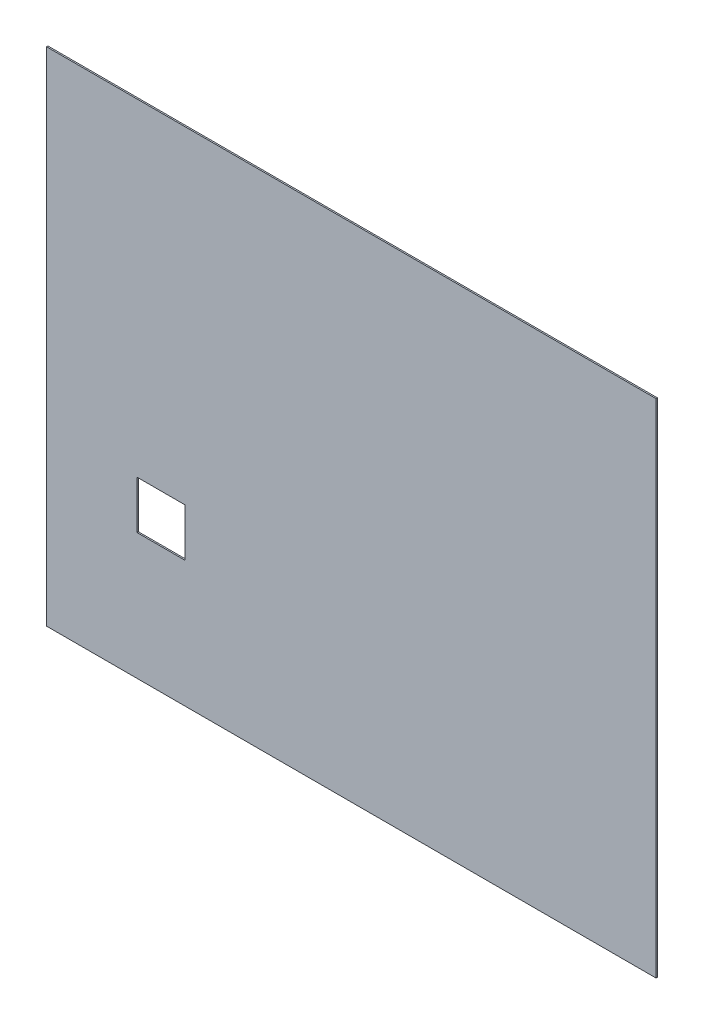
ISO-10303-21;
HEADER;
FILE_DESCRIPTION(('STEP AP214'),'2;1');
FILE_NAME('part.step','',(''),(''),'','','');
FILE_SCHEMA(('AUTOMOTIVE_DESIGN { 1 0 10303 214 1 1 1 1 }'));
ENDSEC;
DATA;
#1=APPLICATION_CONTEXT('core data for automotive mechanical design processes');
#2=APPLICATION_PROTOCOL_DEFINITION('international standard','automotive_design',2000,#1);
#3=PRODUCT_CONTEXT('',#1,'mechanical');
#4=PRODUCT('Part','Part','',(#3));
#5=PRODUCT_RELATED_PRODUCT_CATEGORY('part','',(#4));
#6=PRODUCT_DEFINITION_FORMATION('','',#4);
#7=PRODUCT_DEFINITION_CONTEXT('part definition',#1,'design');
#8=PRODUCT_DEFINITION('design','',#6,#7);
#9=PRODUCT_DEFINITION_SHAPE('','',#8);
#10=(LENGTH_UNIT() NAMED_UNIT(*) SI_UNIT(.MILLI.,.METRE.));
#11=(NAMED_UNIT(*) PLANE_ANGLE_UNIT() SI_UNIT($,.RADIAN.));
#12=(NAMED_UNIT(*) SI_UNIT($,.STERADIAN.) SOLID_ANGLE_UNIT());
#13=UNCERTAINTY_MEASURE_WITH_UNIT(LENGTH_MEASURE(1.E-05),#10,'distance_accuracy_value','');
#14=(GEOMETRIC_REPRESENTATION_CONTEXT(3) GLOBAL_UNCERTAINTY_ASSIGNED_CONTEXT((#13)) GLOBAL_UNIT_ASSIGNED_CONTEXT((#10,
#11,#12)) REPRESENTATION_CONTEXT('',''));
#15=CARTESIAN_POINT('',(0.,0.,0.));
#16=DIRECTION('',(0.,0.,1.));
#17=DIRECTION('',(1.,0.,0.));
#18=AXIS2_PLACEMENT_3D('',#15,#16,#17);
#19=CARTESIAN_POINT('',(215.9,-177.8,0.9906));
#20=DIRECTION('',(-1.,0.,0.));
#21=DIRECTION('',(0.,0.,1.));
#22=AXIS2_PLACEMENT_3D('',#19,#20,#21);
#23=PLANE('',#22);
#24=DIRECTION('',(0.,1.,0.));
#25=VECTOR('',#24,1.);
#26=CARTESIAN_POINT('',(215.9,-177.8,0.));
#27=LINE('',#26,#25);
#28=CARTESIAN_POINT('',(215.9,-177.8,0.));
#29=VERTEX_POINT('',#28);
#30=CARTESIAN_POINT('',(215.9,177.8,0.));
#31=VERTEX_POINT('',#30);
#32=EDGE_CURVE('E151',#29,#31,#27,.T.);
#33=ORIENTED_EDGE('',*,*,#32,.T.);
#34=DIRECTION('',(0.,0.,-1.));
#35=VECTOR('',#34,1.);
#36=CARTESIAN_POINT('',(215.9,177.8,0.9906));
#37=LINE('',#36,#35);
#38=CARTESIAN_POINT('',(215.9,177.8,0.9906));
#39=VERTEX_POINT('',#38);
#40=EDGE_CURVE('E11',#39,#31,#37,.T.);
#41=ORIENTED_EDGE('',*,*,#40,.F.);
#42=DIRECTION('',(0.,1.,0.));
#43=VECTOR('',#42,1.);
#44=CARTESIAN_POINT('',(215.9,-177.8,0.9906));
#45=LINE('',#44,#43);
#46=CARTESIAN_POINT('',(215.9,-177.8,0.9906));
#47=VERTEX_POINT('',#46);
#48=EDGE_CURVE('E157',#47,#39,#45,.T.);
#49=ORIENTED_EDGE('',*,*,#48,.F.);
#50=DIRECTION('',(0.,0.,-1.));
#51=VECTOR('',#50,1.);
#52=CARTESIAN_POINT('',(215.9,-177.8,0.9906));
#53=LINE('',#52,#51);
#54=EDGE_CURVE('E171',#47,#29,#53,.T.);
#55=ORIENTED_EDGE('',*,*,#54,.T.);
#56=EDGE_LOOP('',(#33,#41,#49,#55));
#57=FACE_BOUND('',#56,.T.);
#58=ADVANCED_FACE('F39',(#57),#23,.F.);
#59=CARTESIAN_POINT('',(-215.9,177.8,0.9906));
#60=DIRECTION('',(0.,-1.,0.));
#61=DIRECTION('',(0.,0.,-1.));
#62=AXIS2_PLACEMENT_3D('',#59,#60,#61);
#63=PLANE('',#62);
#64=DIRECTION('',(-1.,0.,0.));
#65=VECTOR('',#64,1.);
#66=CARTESIAN_POINT('',(-215.9,177.8,0.));
#67=LINE('',#66,#65);
#68=CARTESIAN_POINT('',(-215.9,177.8,0.));
#69=VERTEX_POINT('',#68);
#70=EDGE_CURVE('E175',#31,#69,#67,.T.);
#71=ORIENTED_EDGE('',*,*,#70,.T.);
#72=DIRECTION('',(0.,0.,-1.));
#73=VECTOR('',#72,1.);
#74=CARTESIAN_POINT('',(-215.9,177.8,0.9906));
#75=LINE('',#74,#73);
#76=CARTESIAN_POINT('',(-215.9,177.8,0.9906));
#77=VERTEX_POINT('',#76);
#78=EDGE_CURVE('E47',#77,#69,#75,.T.);
#79=ORIENTED_EDGE('',*,*,#78,.F.);
#80=DIRECTION('',(-1.,0.,0.));
#81=VECTOR('',#80,1.);
#82=CARTESIAN_POINT('',(-215.9,177.8,0.9906));
#83=LINE('',#82,#81);
#84=EDGE_CURVE('E161',#39,#77,#83,.T.);
#85=ORIENTED_EDGE('',*,*,#84,.F.);
#86=ORIENTED_EDGE('',*,*,#40,.T.);
#87=EDGE_LOOP('',(#71,#79,#85,#86));
#88=FACE_BOUND('',#87,.T.);
#89=ADVANCED_FACE('F209',(#88),#63,.F.);
#90=CARTESIAN_POINT('',(-215.9,-177.8,0.9906));
#91=DIRECTION('',(1.,0.,0.));
#92=DIRECTION('',(0.,0.,-1.));
#93=AXIS2_PLACEMENT_3D('',#90,#91,#92);
#94=PLANE('',#93);
#95=DIRECTION('',(0.,-1.,0.));
#96=VECTOR('',#95,1.);
#97=CARTESIAN_POINT('',(-215.9,-177.8,0.));
#98=LINE('',#97,#96);
#99=CARTESIAN_POINT('',(-215.9,-177.8,0.));
#100=VERTEX_POINT('',#99);
#101=EDGE_CURVE('E178',#69,#100,#98,.T.);
#102=ORIENTED_EDGE('',*,*,#101,.T.);
#103=DIRECTION('',(0.,0.,-1.));
#104=VECTOR('',#103,1.);
#105=CARTESIAN_POINT('',(-215.9,-177.8,0.9906));
#106=LINE('',#105,#104);
#107=CARTESIAN_POINT('',(-215.9,-177.8,0.9906));
#108=VERTEX_POINT('',#107);
#109=EDGE_CURVE('E186',#108,#100,#106,.T.);
#110=ORIENTED_EDGE('',*,*,#109,.F.);
#111=DIRECTION('',(0.,-1.,0.));
#112=VECTOR('',#111,1.);
#113=CARTESIAN_POINT('',(-215.9,-177.8,0.9906));
#114=LINE('',#113,#112);
#115=EDGE_CURVE('E165',#77,#108,#114,.T.);
#116=ORIENTED_EDGE('',*,*,#115,.F.);
#117=ORIENTED_EDGE('',*,*,#78,.T.);
#118=EDGE_LOOP('',(#102,#110,#116,#117));
#119=FACE_BOUND('',#118,.T.);
#120=ADVANCED_FACE('F195',(#119),#94,.F.);
#121=CARTESIAN_POINT('',(-215.9,-177.8,0.9906));
#122=DIRECTION('',(0.,1.,0.));
#123=DIRECTION('',(0.,0.,1.));
#124=AXIS2_PLACEMENT_3D('',#121,#122,#123);
#125=PLANE('',#124);
#126=DIRECTION('',(1.,0.,0.));
#127=VECTOR('',#126,1.);
#128=CARTESIAN_POINT('',(-215.9,-177.8,0.));
#129=LINE('',#128,#127);
#130=EDGE_CURVE('E162',#100,#29,#129,.T.);
#131=ORIENTED_EDGE('',*,*,#130,.T.);
#132=ORIENTED_EDGE('',*,*,#54,.F.);
#133=DIRECTION('',(1.,0.,0.));
#134=VECTOR('',#133,1.);
#135=CARTESIAN_POINT('',(-215.9,-177.8,0.9906));
#136=LINE('',#135,#134);
#137=EDGE_CURVE('E168',#108,#47,#136,.T.);
#138=ORIENTED_EDGE('',*,*,#137,.F.);
#139=ORIENTED_EDGE('',*,*,#109,.T.);
#140=EDGE_LOOP('',(#131,#132,#138,#139));
#141=FACE_BOUND('',#140,.T.);
#142=ADVANCED_FACE('F202',(#141),#125,.F.);
#143=CARTESIAN_POINT('',(0.,0.,0.9906));
#144=DIRECTION('',(0.,0.,-1.));
#145=DIRECTION('',(-1.,0.,0.));
#146=AXIS2_PLACEMENT_3D('',#143,#144,#145);
#147=PLANE('',#146);
#148=DIRECTION('',(-1.,0.,0.));
#149=VECTOR('',#148,1.);
#150=CARTESIAN_POINT('',(-151.9,-54.3,0.9906));
#151=LINE('',#150,#149);
#152=CARTESIAN_POINT('',(-117.9,-54.3,0.9906));
#153=VERTEX_POINT('',#152);
#154=CARTESIAN_POINT('',(-151.9,-54.3,0.9906));
#155=VERTEX_POINT('',#154);
#156=EDGE_CURVE('E141',#153,#155,#151,.T.);
#157=ORIENTED_EDGE('',*,*,#156,.F.);
#158=DIRECTION('',(0.,1.,0.));
#159=VECTOR('',#158,1.);
#160=CARTESIAN_POINT('',(-117.9,-88.3,0.9906));
#161=LINE('',#160,#159);
#162=CARTESIAN_POINT('',(-117.9,-88.3,0.9906));
#163=VERTEX_POINT('',#162);
#164=EDGE_CURVE('E54',#163,#153,#161,.T.);
#165=ORIENTED_EDGE('',*,*,#164,.F.);
#166=DIRECTION('',(1.,0.,0.));
#167=VECTOR('',#166,1.);
#168=CARTESIAN_POINT('',(-151.9,-88.3,0.9906));
#169=LINE('',#168,#167);
#170=CARTESIAN_POINT('',(-151.9,-88.3,0.9906));
#171=VERTEX_POINT('',#170);
#172=EDGE_CURVE('E125',#171,#163,#169,.T.);
#173=ORIENTED_EDGE('',*,*,#172,.F.);
#174=DIRECTION('',(0.,-1.,0.));
#175=VECTOR('',#174,1.);
#176=CARTESIAN_POINT('',(-151.9,-88.3,0.9906));
#177=LINE('',#176,#175);
#178=EDGE_CURVE('E129',#155,#171,#177,.T.);
#179=ORIENTED_EDGE('',*,*,#178,.F.);
#180=EDGE_LOOP('',(#157,#165,#173,#179));
#181=FACE_BOUND('',#180,.T.);
#182=ORIENTED_EDGE('',*,*,#48,.T.);
#183=ORIENTED_EDGE('',*,*,#84,.T.);
#184=ORIENTED_EDGE('',*,*,#115,.T.);
#185=ORIENTED_EDGE('',*,*,#137,.T.);
#186=EDGE_LOOP('',(#182,#183,#184,#185));
#187=FACE_BOUND('',#186,.T.);
#188=ADVANCED_FACE('F208',(#181,#187),#147,.F.);
#189=CARTESIAN_POINT('',(0.,0.,0.));
#190=DIRECTION('',(0.,0.,-1.));
#191=DIRECTION('',(-1.,0.,0.));
#192=AXIS2_PLACEMENT_3D('',#189,#190,#191);
#193=PLANE('',#192);
#194=CARTESIAN_POINT('',(-178.932328771552,-142.488335238859,0.));
#195=DIRECTION('',(0.,0.,-1.));
#196=DIRECTION('',(-1.,0.,0.));
#197=AXIS2_PLACEMENT_3D('',#194,#195,#196);
#198=CIRCLE('',#197,15.9184710640516);
#199=CARTESIAN_POINT('',(-163.013857707501,-142.488335238859,0.));
#200=VERTEX_POINT('',#199);
#201=EDGE_CURVE('E274',#200,#200,#198,.T.);
#202=ORIENTED_EDGE('',*,*,#201,.F.);
#203=EDGE_LOOP('',(#202));
#204=FACE_BOUND('',#203,.T.);
#205=CARTESIAN_POINT('',(176.007004595451,-138.100348974707,0.));
#206=DIRECTION('',(0.,0.,-1.));
#207=DIRECTION('',(-1.,0.,0.));
#208=AXIS2_PLACEMENT_3D('',#205,#206,#207);
#209=CIRCLE('',#208,16.8117791918624);
#210=CARTESIAN_POINT('',(192.818783787313,-138.100348974707,0.));
#211=VERTEX_POINT('',#210);
#212=EDGE_CURVE('E273',#211,#211,#209,.T.);
#213=ORIENTED_EDGE('',*,*,#212,.F.);
#214=EDGE_LOOP('',(#213));
#215=FACE_BOUND('',#214,.T.);
#216=CARTESIAN_POINT('',(-178.932328771552,148.581420283257,0.));
#217=DIRECTION('',(0.,0.,-1.));
#218=DIRECTION('',(-1.,0.,0.));
#219=AXIS2_PLACEMENT_3D('',#216,#217,#218);
#220=CIRCLE('',#219,17.9403983595496);
#221=CARTESIAN_POINT('',(-160.991930412003,148.581420283257,0.));
#222=VERTEX_POINT('',#221);
#223=EDGE_CURVE('E286',#222,#222,#220,.T.);
#224=ORIENTED_EDGE('',*,*,#223,.F.);
#225=EDGE_LOOP('',(#224));
#226=FACE_BOUND('',#225,.T.);
#227=CARTESIAN_POINT('',(152.604411186637,148.581420283257,0.));
#228=DIRECTION('',(0.,0.,-1.));
#229=DIRECTION('',(-1.,0.,0.));
#230=AXIS2_PLACEMENT_3D('',#227,#228,#229);
#231=CIRCLE('',#230,16.8117791918624);
#232=CARTESIAN_POINT('',(169.4161903785,148.581420283257,0.));
#233=VERTEX_POINT('',#232);
#234=EDGE_CURVE('E132',#233,#233,#231,.T.);
#235=ORIENTED_EDGE('',*,*,#234,.F.);
#236=EDGE_LOOP('',(#235));
#237=FACE_BOUND('',#236,.T.);
#238=DIRECTION('',(0.,1.,0.));
#239=VECTOR('',#238,1.);
#240=CARTESIAN_POINT('',(-117.9,-88.3,0.));
#241=LINE('',#240,#239);
#242=CARTESIAN_POINT('',(-117.9,-88.3,0.));
#243=VERTEX_POINT('',#242);
#244=CARTESIAN_POINT('',(-117.9,-54.3,0.));
#245=VERTEX_POINT('',#244);
#246=EDGE_CURVE('E106',#243,#245,#241,.T.);
#247=ORIENTED_EDGE('',*,*,#246,.T.);
#248=DIRECTION('',(-1.,0.,0.));
#249=VECTOR('',#248,1.);
#250=CARTESIAN_POINT('',(-151.9,-54.3,0.));
#251=LINE('',#250,#249);
#252=CARTESIAN_POINT('',(-151.9,-54.3,0.));
#253=VERTEX_POINT('',#252);
#254=EDGE_CURVE('E116',#245,#253,#251,.T.);
#255=ORIENTED_EDGE('',*,*,#254,.T.);
#256=DIRECTION('',(0.,-1.,0.));
#257=VECTOR('',#256,1.);
#258=CARTESIAN_POINT('',(-151.9,-88.3,0.));
#259=LINE('',#258,#257);
#260=CARTESIAN_POINT('',(-151.9,-88.3,0.));
#261=VERTEX_POINT('',#260);
#262=EDGE_CURVE('E62',#253,#261,#259,.T.);
#263=ORIENTED_EDGE('',*,*,#262,.T.);
#264=DIRECTION('',(1.,0.,0.));
#265=VECTOR('',#264,1.);
#266=CARTESIAN_POINT('',(-151.9,-88.3,0.));
#267=LINE('',#266,#265);
#268=EDGE_CURVE('E113',#261,#243,#267,.T.);
#269=ORIENTED_EDGE('',*,*,#268,.T.);
#270=EDGE_LOOP('',(#247,#255,#263,#269));
#271=FACE_BOUND('',#270,.T.);
#272=ORIENTED_EDGE('',*,*,#32,.F.);
#273=ORIENTED_EDGE('',*,*,#130,.F.);
#274=ORIENTED_EDGE('',*,*,#101,.F.);
#275=ORIENTED_EDGE('',*,*,#70,.F.);
#276=EDGE_LOOP('',(#272,#273,#274,#275));
#277=FACE_BOUND('',#276,.T.);
#278=ADVANCED_FACE('F121',(#204,#215,#226,#237,#271,#277),#193,.T.);
#279=CARTESIAN_POINT('',(-117.9,-88.3,0.));
#280=DIRECTION('',(1.,0.,0.));
#281=DIRECTION('',(0.,0.,-1.));
#282=AXIS2_PLACEMENT_3D('',#279,#280,#281);
#283=PLANE('',#282);
#284=ORIENTED_EDGE('',*,*,#164,.T.);
#285=DIRECTION('',(0.,0.,1.));
#286=VECTOR('',#285,1.);
#287=CARTESIAN_POINT('',(-117.9,-54.3,0.));
#288=LINE('',#287,#286);
#289=EDGE_CURVE('E102',#245,#153,#288,.T.);
#290=ORIENTED_EDGE('',*,*,#289,.F.);
#291=ORIENTED_EDGE('',*,*,#246,.F.);
#292=DIRECTION('',(0.,0.,1.));
#293=VECTOR('',#292,1.);
#294=CARTESIAN_POINT('',(-117.9,-88.3,0.));
#295=LINE('',#294,#293);
#296=EDGE_CURVE('E148',#243,#163,#295,.T.);
#297=ORIENTED_EDGE('',*,*,#296,.T.);
#298=EDGE_LOOP('',(#284,#290,#291,#297));
#299=FACE_BOUND('',#298,.T.);
#300=ADVANCED_FACE('F104',(#299),#283,.F.);
#301=CARTESIAN_POINT('',(-151.9,-88.3,0.));
#302=DIRECTION('',(0.,-1.,0.));
#303=DIRECTION('',(0.,0.,-1.));
#304=AXIS2_PLACEMENT_3D('',#301,#302,#303);
#305=PLANE('',#304);
#306=ORIENTED_EDGE('',*,*,#172,.T.);
#307=ORIENTED_EDGE('',*,*,#296,.F.);
#308=ORIENTED_EDGE('',*,*,#268,.F.);
#309=DIRECTION('',(0.,0.,1.));
#310=VECTOR('',#309,1.);
#311=CARTESIAN_POINT('',(-151.9,-88.3,0.));
#312=LINE('',#311,#310);
#313=EDGE_CURVE('E152',#261,#171,#312,.T.);
#314=ORIENTED_EDGE('',*,*,#313,.T.);
#315=EDGE_LOOP('',(#306,#307,#308,#314));
#316=FACE_BOUND('',#315,.T.);
#317=ADVANCED_FACE('F227',(#316),#305,.F.);
#318=CARTESIAN_POINT('',(-151.9,-88.3,0.));
#319=DIRECTION('',(-1.,0.,0.));
#320=DIRECTION('',(0.,0.,1.));
#321=AXIS2_PLACEMENT_3D('',#318,#319,#320);
#322=PLANE('',#321);
#323=ORIENTED_EDGE('',*,*,#178,.T.);
#324=ORIENTED_EDGE('',*,*,#313,.F.);
#325=ORIENTED_EDGE('',*,*,#262,.F.);
#326=DIRECTION('',(0.,0.,1.));
#327=VECTOR('',#326,1.);
#328=CARTESIAN_POINT('',(-151.9,-54.3,0.));
#329=LINE('',#328,#327);
#330=EDGE_CURVE('E112',#253,#155,#329,.T.);
#331=ORIENTED_EDGE('',*,*,#330,.T.);
#332=EDGE_LOOP('',(#323,#324,#325,#331));
#333=FACE_BOUND('',#332,.T.);
#334=ADVANCED_FACE('F231',(#333),#322,.F.);
#335=CARTESIAN_POINT('',(-151.9,-54.3,0.));
#336=DIRECTION('',(0.,1.,0.));
#337=DIRECTION('',(0.,0.,1.));
#338=AXIS2_PLACEMENT_3D('',#335,#336,#337);
#339=PLANE('',#338);
#340=ORIENTED_EDGE('',*,*,#156,.T.);
#341=ORIENTED_EDGE('',*,*,#330,.F.);
#342=ORIENTED_EDGE('',*,*,#254,.F.);
#343=ORIENTED_EDGE('',*,*,#289,.T.);
#344=EDGE_LOOP('',(#340,#341,#342,#343));
#345=FACE_BOUND('',#344,.T.);
#346=ADVANCED_FACE('F117',(#345),#339,.F.);
#347=CARTESIAN_POINT('',(152.604411186637,148.581420283257,-7.62));
#348=DIRECTION('',(0.,0.,1.));
#349=DIRECTION('',(1.,0.,0.));
#350=AXIS2_PLACEMENT_3D('',#347,#348,#349);
#351=CYLINDRICAL_SURFACE('',#350,16.8117791918624);
#352=CARTESIAN_POINT('',(152.604411186637,148.581420283257,-7.62));
#353=DIRECTION('',(0.,0.,-1.));
#354=DIRECTION('',(-1.,0.,0.));
#355=AXIS2_PLACEMENT_3D('',#352,#353,#354);
#356=CIRCLE('',#355,16.8117791918624);
#357=CARTESIAN_POINT('',(169.4161903785,148.581420283257,-7.62));
#358=VERTEX_POINT('',#357);
#359=EDGE_CURVE('E142',#358,#358,#356,.T.);
#360=CARTESIAN_POINT('',(169.4161903785,148.581420283257,-7.62));
#361=CARTESIAN_POINT('',(169.4161903785,148.581420283257,-7.540625));
#362=CARTESIAN_POINT('',(169.4161903785,148.581420283257,-7.46125));
#363=CARTESIAN_POINT('',(169.4161903785,148.581420283257,-7.3025));
#364=CARTESIAN_POINT('',(169.4161903785,148.581420283257,-7.223125));
#365=CARTESIAN_POINT('',(169.4161903785,148.581420283257,-7.064375));
#366=CARTESIAN_POINT('',(169.4161903785,148.581420283257,-6.985));
#367=CARTESIAN_POINT('',(169.4161903785,148.581420283257,-6.82625));
#368=CARTESIAN_POINT('',(169.4161903785,148.581420283257,-6.746875));
#369=CARTESIAN_POINT('',(169.4161903785,148.581420283257,-6.588125));
#370=CARTESIAN_POINT('',(169.4161903785,148.581420283257,-6.50875));
#371=CARTESIAN_POINT('',(169.4161903785,148.581420283257,-6.35));
#372=CARTESIAN_POINT('',(169.4161903785,148.581420283257,-6.270625));
#373=CARTESIAN_POINT('',(169.4161903785,148.581420283257,-6.111875));
#374=CARTESIAN_POINT('',(169.4161903785,148.581420283257,-6.0325));
#375=CARTESIAN_POINT('',(169.4161903785,148.581420283257,-5.87375));
#376=CARTESIAN_POINT('',(169.4161903785,148.581420283257,-5.794375));
#377=CARTESIAN_POINT('',(169.4161903785,148.581420283257,-5.635625));
#378=CARTESIAN_POINT('',(169.4161903785,148.581420283257,-5.55625));
#379=CARTESIAN_POINT('',(169.4161903785,148.581420283257,-5.3975));
#380=CARTESIAN_POINT('',(169.4161903785,148.581420283257,-5.318125));
#381=CARTESIAN_POINT('',(169.4161903785,148.581420283257,-5.159375));
#382=CARTESIAN_POINT('',(169.4161903785,148.581420283257,-5.08));
#383=CARTESIAN_POINT('',(169.4161903785,148.581420283257,-4.92125));
#384=CARTESIAN_POINT('',(169.4161903785,148.581420283257,-4.841875));
#385=CARTESIAN_POINT('',(169.4161903785,148.581420283257,-4.683125));
#386=CARTESIAN_POINT('',(169.4161903785,148.581420283257,-4.60375));
#387=CARTESIAN_POINT('',(169.4161903785,148.581420283257,-4.445));
#388=CARTESIAN_POINT('',(169.4161903785,148.581420283257,-4.365625));
#389=CARTESIAN_POINT('',(169.4161903785,148.581420283257,-4.206875));
#390=CARTESIAN_POINT('',(169.4161903785,148.581420283257,-4.1275));
#391=CARTESIAN_POINT('',(169.4161903785,148.581420283257,-3.96875));
#392=CARTESIAN_POINT('',(169.4161903785,148.581420283257,-3.889375));
#393=CARTESIAN_POINT('',(169.4161903785,148.581420283257,-3.730625));
#394=CARTESIAN_POINT('',(169.4161903785,148.581420283257,-3.65125));
#395=CARTESIAN_POINT('',(169.4161903785,148.581420283257,-3.4925));
#396=CARTESIAN_POINT('',(169.4161903785,148.581420283257,-3.413125));
#397=CARTESIAN_POINT('',(169.4161903785,148.581420283257,-3.254375));
#398=CARTESIAN_POINT('',(169.4161903785,148.581420283257,-3.175));
#399=CARTESIAN_POINT('',(169.4161903785,148.581420283257,-3.01625));
#400=CARTESIAN_POINT('',(169.4161903785,148.581420283257,-2.936875));
#401=CARTESIAN_POINT('',(169.4161903785,148.581420283257,-2.778125));
#402=CARTESIAN_POINT('',(169.4161903785,148.581420283257,-2.69875));
#403=CARTESIAN_POINT('',(169.4161903785,148.581420283257,-2.54));
#404=CARTESIAN_POINT('',(169.4161903785,148.581420283257,-2.460625));
#405=CARTESIAN_POINT('',(169.4161903785,148.581420283257,-2.301875));
#406=CARTESIAN_POINT('',(169.4161903785,148.581420283257,-2.2225));
#407=CARTESIAN_POINT('',(169.4161903785,148.581420283257,-2.06375));
#408=CARTESIAN_POINT('',(169.4161903785,148.581420283257,-1.984375));
#409=CARTESIAN_POINT('',(169.4161903785,148.581420283257,-1.825625));
#410=CARTESIAN_POINT('',(169.4161903785,148.581420283257,-1.74625));
#411=CARTESIAN_POINT('',(169.4161903785,148.581420283257,-1.5875));
#412=CARTESIAN_POINT('',(169.4161903785,148.581420283257,-1.508125));
#413=CARTESIAN_POINT('',(169.4161903785,148.581420283257,-1.349375));
#414=CARTESIAN_POINT('',(169.4161903785,148.581420283257,-1.27));
#415=CARTESIAN_POINT('',(169.4161903785,148.581420283257,-1.11125));
#416=CARTESIAN_POINT('',(169.4161903785,148.581420283257,-1.031875));
#417=CARTESIAN_POINT('',(169.4161903785,148.581420283257,-0.873125));
#418=CARTESIAN_POINT('',(169.4161903785,148.581420283257,-0.79375));
#419=CARTESIAN_POINT('',(169.4161903785,148.581420283257,-0.635));
#420=CARTESIAN_POINT('',(169.4161903785,148.581420283257,-0.555625));
#421=CARTESIAN_POINT('',(169.4161903785,148.581420283257,-0.396875));
#422=CARTESIAN_POINT('',(169.4161903785,148.581420283257,-0.3175));
#423=CARTESIAN_POINT('',(169.4161903785,148.581420283257,-0.15875));
#424=CARTESIAN_POINT('',(169.4161903785,148.581420283257,-0.0793749999999999));
#425=CARTESIAN_POINT('',(169.4161903785,148.581420283257,0.));
#426=B_SPLINE_CURVE_WITH_KNOTS('',3,(#360,#361,#362,#363,#364,#365,#366,#367,#368,#369,#370,
#371,#372,#373,#374,#375,#376,#377,#378,#379,#380,#381,#382,#383,#384,#385,#386,#387,#388,#389,
#390,#391,#392,#393,#394,#395,#396,#397,#398,#399,#400,#401,#402,#403,#404,#405,#406,#407,#408,
#409,#410,#411,#412,#413,#414,#415,#416,#417,#418,#419,#420,#421,#422,#423,#424,#425),
.UNSPECIFIED.,.F.,.F.,(4,2,2,2,2,2,2,2,2,2,2,2,2,2,2,2,2,2,2,2,2,2,2,2,2,2,2,2,2,2,2,2,4),(0.,
0.238125,0.47625,0.714375000000001,0.9525,1.190625,1.42875,1.666875,1.905,2.143125,2.38125,
2.619375,2.8575,3.095625,3.33375,3.571875,3.81,4.048125,4.28625,4.524375,4.7625,5.000625,
5.23875,5.476875,5.715,5.953125,6.19125,6.429375,6.6675,6.905625,7.14375,7.381875,7.62),.UNSPECIFIED.);
#427=EDGE_CURVE('BSEAM230',#358,#233,#426,.T.);
#428=ORIENTED_EDGE('',*,*,#359,.F.);
#429=ORIENTED_EDGE('',*,*,#234,.T.);
#430=ORIENTED_EDGE('',*,*,#427,.T.);
#431=ORIENTED_EDGE('',*,*,#427,.F.);
#432=EDGE_LOOP('',(#428,#430,#429,#431));
#433=FACE_BOUND('',#432,.T.);
#434=ADVANCED_FACE('F230',(#433),#351,.T.);
#435=CARTESIAN_POINT('',(152.604411186637,148.581420283257,-7.62));
#436=DIRECTION('',(0.,0.,-1.));
#437=DIRECTION('',(-1.,0.,0.));
#438=AXIS2_PLACEMENT_3D('',#435,#436,#437);
#439=PLANE('',#438);
#440=ORIENTED_EDGE('',*,*,#359,.T.);
#441=EDGE_LOOP('',(#440));
#442=FACE_BOUND('',#441,.T.);
#443=ADVANCED_FACE('F239',(#442),#439,.T.);
#444=CARTESIAN_POINT('',(-178.932328771552,148.581420283257,-7.62));
#445=DIRECTION('',(0.,0.,1.));
#446=DIRECTION('',(1.,0.,0.));
#447=AXIS2_PLACEMENT_3D('',#444,#445,#446);
#448=CYLINDRICAL_SURFACE('',#447,17.9403983595496);
#449=CARTESIAN_POINT('',(-178.932328771552,148.581420283257,-7.62));
#450=DIRECTION('',(0.,0.,-1.));
#451=DIRECTION('',(-1.,0.,0.));
#452=AXIS2_PLACEMENT_3D('',#449,#450,#451);
#453=CIRCLE('',#452,17.9403983595496);
#454=CARTESIAN_POINT('',(-160.991930412003,148.581420283257,-7.62));
#455=VERTEX_POINT('',#454);
#456=EDGE_CURVE('E288',#455,#455,#453,.T.);
#457=CARTESIAN_POINT('',(-160.991930412003,148.581420283257,-7.62));
#458=CARTESIAN_POINT('',(-160.991930412003,148.581420283257,-7.540625));
#459=CARTESIAN_POINT('',(-160.991930412003,148.581420283257,-7.46125));
#460=CARTESIAN_POINT('',(-160.991930412003,148.581420283257,-7.3025));
#461=CARTESIAN_POINT('',(-160.991930412003,148.581420283257,-7.223125));
#462=CARTESIAN_POINT('',(-160.991930412003,148.581420283257,-7.064375));
#463=CARTESIAN_POINT('',(-160.991930412003,148.581420283257,-6.985));
#464=CARTESIAN_POINT('',(-160.991930412003,148.581420283257,-6.82625));
#465=CARTESIAN_POINT('',(-160.991930412003,148.581420283257,-6.746875));
#466=CARTESIAN_POINT('',(-160.991930412003,148.581420283257,-6.588125));
#467=CARTESIAN_POINT('',(-160.991930412003,148.581420283257,-6.50875));
#468=CARTESIAN_POINT('',(-160.991930412003,148.581420283257,-6.35));
#469=CARTESIAN_POINT('',(-160.991930412003,148.581420283257,-6.270625));
#470=CARTESIAN_POINT('',(-160.991930412003,148.581420283257,-6.111875));
#471=CARTESIAN_POINT('',(-160.991930412003,148.581420283257,-6.0325));
#472=CARTESIAN_POINT('',(-160.991930412003,148.581420283257,-5.87375));
#473=CARTESIAN_POINT('',(-160.991930412003,148.581420283257,-5.794375));
#474=CARTESIAN_POINT('',(-160.991930412003,148.581420283257,-5.635625));
#475=CARTESIAN_POINT('',(-160.991930412003,148.581420283257,-5.55625));
#476=CARTESIAN_POINT('',(-160.991930412003,148.581420283257,-5.3975));
#477=CARTESIAN_POINT('',(-160.991930412003,148.581420283257,-5.318125));
#478=CARTESIAN_POINT('',(-160.991930412003,148.581420283257,-5.159375));
#479=CARTESIAN_POINT('',(-160.991930412003,148.581420283257,-5.08));
#480=CARTESIAN_POINT('',(-160.991930412003,148.581420283257,-4.92125));
#481=CARTESIAN_POINT('',(-160.991930412003,148.581420283257,-4.841875));
#482=CARTESIAN_POINT('',(-160.991930412003,148.581420283257,-4.683125));
#483=CARTESIAN_POINT('',(-160.991930412003,148.581420283257,-4.60375));
#484=CARTESIAN_POINT('',(-160.991930412003,148.581420283257,-4.445));
#485=CARTESIAN_POINT('',(-160.991930412003,148.581420283257,-4.365625));
#486=CARTESIAN_POINT('',(-160.991930412003,148.581420283257,-4.206875));
#487=CARTESIAN_POINT('',(-160.991930412003,148.581420283257,-4.1275));
#488=CARTESIAN_POINT('',(-160.991930412003,148.581420283257,-3.96875));
#489=CARTESIAN_POINT('',(-160.991930412003,148.581420283257,-3.889375));
#490=CARTESIAN_POINT('',(-160.991930412003,148.581420283257,-3.730625));
#491=CARTESIAN_POINT('',(-160.991930412003,148.581420283257,-3.65125));
#492=CARTESIAN_POINT('',(-160.991930412003,148.581420283257,-3.4925));
#493=CARTESIAN_POINT('',(-160.991930412003,148.581420283257,-3.413125));
#494=CARTESIAN_POINT('',(-160.991930412003,148.581420283257,-3.254375));
#495=CARTESIAN_POINT('',(-160.991930412003,148.581420283257,-3.175));
#496=CARTESIAN_POINT('',(-160.991930412003,148.581420283257,-3.01625));
#497=CARTESIAN_POINT('',(-160.991930412003,148.581420283257,-2.936875));
#498=CARTESIAN_POINT('',(-160.991930412003,148.581420283257,-2.778125));
#499=CARTESIAN_POINT('',(-160.991930412003,148.581420283257,-2.69875));
#500=CARTESIAN_POINT('',(-160.991930412003,148.581420283257,-2.54));
#501=CARTESIAN_POINT('',(-160.991930412003,148.581420283257,-2.460625));
#502=CARTESIAN_POINT('',(-160.991930412003,148.581420283257,-2.301875));
#503=CARTESIAN_POINT('',(-160.991930412003,148.581420283257,-2.2225));
#504=CARTESIAN_POINT('',(-160.991930412003,148.581420283257,-2.06375));
#505=CARTESIAN_POINT('',(-160.991930412003,148.581420283257,-1.984375));
#506=CARTESIAN_POINT('',(-160.991930412003,148.581420283257,-1.825625));
#507=CARTESIAN_POINT('',(-160.991930412003,148.581420283257,-1.74625));
#508=CARTESIAN_POINT('',(-160.991930412003,148.581420283257,-1.5875));
#509=CARTESIAN_POINT('',(-160.991930412003,148.581420283257,-1.508125));
#510=CARTESIAN_POINT('',(-160.991930412003,148.581420283257,-1.349375));
#511=CARTESIAN_POINT('',(-160.991930412003,148.581420283257,-1.27));
#512=CARTESIAN_POINT('',(-160.991930412003,148.581420283257,-1.11125));
#513=CARTESIAN_POINT('',(-160.991930412003,148.581420283257,-1.031875));
#514=CARTESIAN_POINT('',(-160.991930412003,148.581420283257,-0.873125));
#515=CARTESIAN_POINT('',(-160.991930412003,148.581420283257,-0.79375));
#516=CARTESIAN_POINT('',(-160.991930412003,148.581420283257,-0.635));
#517=CARTESIAN_POINT('',(-160.991930412003,148.581420283257,-0.555625));
#518=CARTESIAN_POINT('',(-160.991930412003,148.581420283257,-0.396875));
#519=CARTESIAN_POINT('',(-160.991930412003,148.581420283257,-0.3175));
#520=CARTESIAN_POINT('',(-160.991930412003,148.581420283257,-0.15875));
#521=CARTESIAN_POINT('',(-160.991930412003,148.581420283257,-0.0793749999999999));
#522=CARTESIAN_POINT('',(-160.991930412003,148.581420283257,0.));
#523=B_SPLINE_CURVE_WITH_KNOTS('',3,(#457,#458,#459,#460,#461,#462,#463,#464,#465,#466,#467,
#468,#469,#470,#471,#472,#473,#474,#475,#476,#477,#478,#479,#480,#481,#482,#483,#484,#485,#486,
#487,#488,#489,#490,#491,#492,#493,#494,#495,#496,#497,#498,#499,#500,#501,#502,#503,#504,#505,
#506,#507,#508,#509,#510,#511,#512,#513,#514,#515,#516,#517,#518,#519,#520,#521,#522),
.UNSPECIFIED.,.F.,.F.,(4,2,2,2,2,2,2,2,2,2,2,2,2,2,2,2,2,2,2,2,2,2,2,2,2,2,2,2,2,2,2,2,4),(0.,
0.238125,0.476249999999999,0.714375,0.952499999999999,1.190625,1.42875,1.666875,1.905,2.143125,
2.38125,2.619375,2.8575,3.095625,3.33375,3.571875,3.81,4.048125,4.28625,4.524375,4.7625,
5.000625,5.23875,5.476875,5.715,5.953125,6.19125,6.429375,6.6675,6.905625,7.14375,7.381875,
7.62),.UNSPECIFIED.);
#524=EDGE_CURVE('BSEAM243',#455,#222,#523,.T.);
#525=ORIENTED_EDGE('',*,*,#456,.F.);
#526=ORIENTED_EDGE('',*,*,#223,.T.);
#527=ORIENTED_EDGE('',*,*,#524,.T.);
#528=ORIENTED_EDGE('',*,*,#524,.F.);
#529=EDGE_LOOP('',(#525,#527,#526,#528));
#530=FACE_BOUND('',#529,.T.);
#531=ADVANCED_FACE('F243',(#530),#448,.T.);
#532=CARTESIAN_POINT('',(-178.932328771552,148.581420283257,-7.62));
#533=DIRECTION('',(0.,0.,-1.));
#534=DIRECTION('',(-1.,0.,0.));
#535=AXIS2_PLACEMENT_3D('',#532,#533,#534);
#536=PLANE('',#535);
#537=ORIENTED_EDGE('',*,*,#456,.T.);
#538=EDGE_LOOP('',(#537));
#539=FACE_BOUND('',#538,.T.);
#540=ADVANCED_FACE('F247',(#539),#536,.T.);
#541=CARTESIAN_POINT('',(176.007004595451,-138.100348974707,-7.62));
#542=DIRECTION('',(0.,0.,1.));
#543=DIRECTION('',(1.,0.,0.));
#544=AXIS2_PLACEMENT_3D('',#541,#542,#543);
#545=CYLINDRICAL_SURFACE('',#544,16.8117791918624);
#546=CARTESIAN_POINT('',(176.007004595451,-138.100348974707,-7.62));
#547=DIRECTION('',(0.,0.,-1.));
#548=DIRECTION('',(-1.,0.,0.));
#549=AXIS2_PLACEMENT_3D('',#546,#547,#548);
#550=CIRCLE('',#549,16.8117791918624);
#551=CARTESIAN_POINT('',(192.818783787313,-138.100348974707,-7.62));
#552=VERTEX_POINT('',#551);
#553=EDGE_CURVE('E279',#552,#552,#550,.T.);
#554=CARTESIAN_POINT('',(192.818783787313,-138.100348974707,-7.62));
#555=CARTESIAN_POINT('',(192.818783787313,-138.100348974707,-7.540625));
#556=CARTESIAN_POINT('',(192.818783787313,-138.100348974707,-7.46125));
#557=CARTESIAN_POINT('',(192.818783787313,-138.100348974707,-7.3025));
#558=CARTESIAN_POINT('',(192.818783787313,-138.100348974707,-7.223125));
#559=CARTESIAN_POINT('',(192.818783787313,-138.100348974707,-7.064375));
#560=CARTESIAN_POINT('',(192.818783787313,-138.100348974707,-6.985));
#561=CARTESIAN_POINT('',(192.818783787313,-138.100348974707,-6.82625));
#562=CARTESIAN_POINT('',(192.818783787313,-138.100348974707,-6.746875));
#563=CARTESIAN_POINT('',(192.818783787313,-138.100348974707,-6.588125));
#564=CARTESIAN_POINT('',(192.818783787313,-138.100348974707,-6.50875));
#565=CARTESIAN_POINT('',(192.818783787313,-138.100348974707,-6.35));
#566=CARTESIAN_POINT('',(192.818783787313,-138.100348974707,-6.270625));
#567=CARTESIAN_POINT('',(192.818783787313,-138.100348974707,-6.111875));
#568=CARTESIAN_POINT('',(192.818783787313,-138.100348974707,-6.0325));
#569=CARTESIAN_POINT('',(192.818783787313,-138.100348974707,-5.87375));
#570=CARTESIAN_POINT('',(192.818783787313,-138.100348974707,-5.794375));
#571=CARTESIAN_POINT('',(192.818783787313,-138.100348974707,-5.635625));
#572=CARTESIAN_POINT('',(192.818783787313,-138.100348974707,-5.55625));
#573=CARTESIAN_POINT('',(192.818783787313,-138.100348974707,-5.3975));
#574=CARTESIAN_POINT('',(192.818783787313,-138.100348974707,-5.318125));
#575=CARTESIAN_POINT('',(192.818783787313,-138.100348974707,-5.159375));
#576=CARTESIAN_POINT('',(192.818783787313,-138.100348974707,-5.08));
#577=CARTESIAN_POINT('',(192.818783787313,-138.100348974707,-4.92125));
#578=CARTESIAN_POINT('',(192.818783787313,-138.100348974707,-4.841875));
#579=CARTESIAN_POINT('',(192.818783787313,-138.100348974707,-4.683125));
#580=CARTESIAN_POINT('',(192.818783787313,-138.100348974707,-4.60375));
#581=CARTESIAN_POINT('',(192.818783787313,-138.100348974707,-4.445));
#582=CARTESIAN_POINT('',(192.818783787313,-138.100348974707,-4.365625));
#583=CARTESIAN_POINT('',(192.818783787313,-138.100348974707,-4.206875));
#584=CARTESIAN_POINT('',(192.818783787313,-138.100348974707,-4.1275));
#585=CARTESIAN_POINT('',(192.818783787313,-138.100348974707,-3.96875));
#586=CARTESIAN_POINT('',(192.818783787313,-138.100348974707,-3.889375));
#587=CARTESIAN_POINT('',(192.818783787313,-138.100348974707,-3.730625));
#588=CARTESIAN_POINT('',(192.818783787313,-138.100348974707,-3.65125));
#589=CARTESIAN_POINT('',(192.818783787313,-138.100348974707,-3.4925));
#590=CARTESIAN_POINT('',(192.818783787313,-138.100348974707,-3.413125));
#591=CARTESIAN_POINT('',(192.818783787313,-138.100348974707,-3.254375));
#592=CARTESIAN_POINT('',(192.818783787313,-138.100348974707,-3.175));
#593=CARTESIAN_POINT('',(192.818783787313,-138.100348974707,-3.01625));
#594=CARTESIAN_POINT('',(192.818783787313,-138.100348974707,-2.936875));
#595=CARTESIAN_POINT('',(192.818783787313,-138.100348974707,-2.778125));
#596=CARTESIAN_POINT('',(192.818783787313,-138.100348974707,-2.69875));
#597=CARTESIAN_POINT('',(192.818783787313,-138.100348974707,-2.54));
#598=CARTESIAN_POINT('',(192.818783787313,-138.100348974707,-2.460625));
#599=CARTESIAN_POINT('',(192.818783787313,-138.100348974707,-2.301875));
#600=CARTESIAN_POINT('',(192.818783787313,-138.100348974707,-2.2225));
#601=CARTESIAN_POINT('',(192.818783787313,-138.100348974707,-2.06375));
#602=CARTESIAN_POINT('',(192.818783787313,-138.100348974707,-1.984375));
#603=CARTESIAN_POINT('',(192.818783787313,-138.100348974707,-1.825625));
#604=CARTESIAN_POINT('',(192.818783787313,-138.100348974707,-1.74625));
#605=CARTESIAN_POINT('',(192.818783787313,-138.100348974707,-1.5875));
#606=CARTESIAN_POINT('',(192.818783787313,-138.100348974707,-1.508125));
#607=CARTESIAN_POINT('',(192.818783787313,-138.100348974707,-1.349375));
#608=CARTESIAN_POINT('',(192.818783787313,-138.100348974707,-1.27));
#609=CARTESIAN_POINT('',(192.818783787313,-138.100348974707,-1.11125));
#610=CARTESIAN_POINT('',(192.818783787313,-138.100348974707,-1.031875));
#611=CARTESIAN_POINT('',(192.818783787313,-138.100348974707,-0.873125));
#612=CARTESIAN_POINT('',(192.818783787313,-138.100348974707,-0.79375));
#613=CARTESIAN_POINT('',(192.818783787313,-138.100348974707,-0.635));
#614=CARTESIAN_POINT('',(192.818783787313,-138.100348974707,-0.555625));
#615=CARTESIAN_POINT('',(192.818783787313,-138.100348974707,-0.396875));
#616=CARTESIAN_POINT('',(192.818783787313,-138.100348974707,-0.3175));
#617=CARTESIAN_POINT('',(192.818783787313,-138.100348974707,-0.15875));
#618=CARTESIAN_POINT('',(192.818783787313,-138.100348974707,-0.0793749999999999));
#619=CARTESIAN_POINT('',(192.818783787313,-138.100348974707,0.));
#620=B_SPLINE_CURVE_WITH_KNOTS('',3,(#554,#555,#556,#557,#558,#559,#560,#561,#562,#563,#564,
#565,#566,#567,#568,#569,#570,#571,#572,#573,#574,#575,#576,#577,#578,#579,#580,#581,#582,#583,
#584,#585,#586,#587,#588,#589,#590,#591,#592,#593,#594,#595,#596,#597,#598,#599,#600,#601,#602,
#603,#604,#605,#606,#607,#608,#609,#610,#611,#612,#613,#614,#615,#616,#617,#618,#619),
.UNSPECIFIED.,.F.,.F.,(4,2,2,2,2,2,2,2,2,2,2,2,2,2,2,2,2,2,2,2,2,2,2,2,2,2,2,2,2,2,2,2,4),(0.,
0.238125,0.47625,0.714375000000001,0.9525,1.190625,1.42875,1.666875,1.905,2.143125,2.38125,
2.619375,2.8575,3.095625,3.33375,3.571875,3.81,4.048125,4.28625,4.524375,4.7625,5.000625,
5.23875,5.476875,5.715,5.953125,6.19125,6.429375,6.6675,6.905625,7.14375,7.381875,7.62),.UNSPECIFIED.);
#621=EDGE_CURVE('BSEAM251',#552,#211,#620,.T.);
#622=ORIENTED_EDGE('',*,*,#553,.F.);
#623=ORIENTED_EDGE('',*,*,#212,.T.);
#624=ORIENTED_EDGE('',*,*,#621,.T.);
#625=ORIENTED_EDGE('',*,*,#621,.F.);
#626=EDGE_LOOP('',(#622,#624,#623,#625));
#627=FACE_BOUND('',#626,.T.);
#628=ADVANCED_FACE('F251',(#627),#545,.T.);
#629=CARTESIAN_POINT('',(176.007004595451,-138.100348974707,-7.62));
#630=DIRECTION('',(0.,0.,-1.));
#631=DIRECTION('',(-1.,0.,0.));
#632=AXIS2_PLACEMENT_3D('',#629,#630,#631);
#633=PLANE('',#632);
#634=ORIENTED_EDGE('',*,*,#553,.T.);
#635=EDGE_LOOP('',(#634));
#636=FACE_BOUND('',#635,.T.);
#637=ADVANCED_FACE('F255',(#636),#633,.T.);
#638=CARTESIAN_POINT('',(-178.932328771552,-142.488335238859,-7.62));
#639=DIRECTION('',(0.,0.,1.));
#640=DIRECTION('',(1.,0.,0.));
#641=AXIS2_PLACEMENT_3D('',#638,#639,#640);
#642=CYLINDRICAL_SURFACE('',#641,15.9184710640516);
#643=CARTESIAN_POINT('',(-178.932328771552,-142.488335238859,-7.62));
#644=DIRECTION('',(0.,0.,-1.));
#645=DIRECTION('',(-1.,0.,0.));
#646=AXIS2_PLACEMENT_3D('',#643,#644,#645);
#647=CIRCLE('',#646,15.9184710640516);
#648=CARTESIAN_POINT('',(-163.013857707501,-142.488335238859,-7.62));
#649=VERTEX_POINT('',#648);
#650=EDGE_CURVE('E271',#649,#649,#647,.T.);
#651=CARTESIAN_POINT('',(-163.013857707501,-142.488335238859,-7.62));
#652=CARTESIAN_POINT('',(-163.013857707501,-142.488335238859,-7.540625));
#653=CARTESIAN_POINT('',(-163.013857707501,-142.488335238859,-7.46125));
#654=CARTESIAN_POINT('',(-163.013857707501,-142.488335238859,-7.3025));
#655=CARTESIAN_POINT('',(-163.013857707501,-142.488335238859,-7.223125));
#656=CARTESIAN_POINT('',(-163.013857707501,-142.488335238859,-7.064375));
#657=CARTESIAN_POINT('',(-163.013857707501,-142.488335238859,-6.985));
#658=CARTESIAN_POINT('',(-163.013857707501,-142.488335238859,-6.82625));
#659=CARTESIAN_POINT('',(-163.013857707501,-142.488335238859,-6.746875));
#660=CARTESIAN_POINT('',(-163.013857707501,-142.488335238859,-6.588125));
#661=CARTESIAN_POINT('',(-163.013857707501,-142.488335238859,-6.50875));
#662=CARTESIAN_POINT('',(-163.013857707501,-142.488335238859,-6.35));
#663=CARTESIAN_POINT('',(-163.013857707501,-142.488335238859,-6.270625));
#664=CARTESIAN_POINT('',(-163.013857707501,-142.488335238859,-6.111875));
#665=CARTESIAN_POINT('',(-163.013857707501,-142.488335238859,-6.0325));
#666=CARTESIAN_POINT('',(-163.013857707501,-142.488335238859,-5.87375));
#667=CARTESIAN_POINT('',(-163.013857707501,-142.488335238859,-5.794375));
#668=CARTESIAN_POINT('',(-163.013857707501,-142.488335238859,-5.635625));
#669=CARTESIAN_POINT('',(-163.013857707501,-142.488335238859,-5.55625));
#670=CARTESIAN_POINT('',(-163.013857707501,-142.488335238859,-5.3975));
#671=CARTESIAN_POINT('',(-163.013857707501,-142.488335238859,-5.318125));
#672=CARTESIAN_POINT('',(-163.013857707501,-142.488335238859,-5.159375));
#673=CARTESIAN_POINT('',(-163.013857707501,-142.488335238859,-5.08));
#674=CARTESIAN_POINT('',(-163.013857707501,-142.488335238859,-4.92125));
#675=CARTESIAN_POINT('',(-163.013857707501,-142.488335238859,-4.841875));
#676=CARTESIAN_POINT('',(-163.013857707501,-142.488335238859,-4.683125));
#677=CARTESIAN_POINT('',(-163.013857707501,-142.488335238859,-4.60375));
#678=CARTESIAN_POINT('',(-163.013857707501,-142.488335238859,-4.445));
#679=CARTESIAN_POINT('',(-163.013857707501,-142.488335238859,-4.365625));
#680=CARTESIAN_POINT('',(-163.013857707501,-142.488335238859,-4.206875));
#681=CARTESIAN_POINT('',(-163.013857707501,-142.488335238859,-4.1275));
#682=CARTESIAN_POINT('',(-163.013857707501,-142.488335238859,-3.96875));
#683=CARTESIAN_POINT('',(-163.013857707501,-142.488335238859,-3.889375));
#684=CARTESIAN_POINT('',(-163.013857707501,-142.488335238859,-3.730625));
#685=CARTESIAN_POINT('',(-163.013857707501,-142.488335238859,-3.65125));
#686=CARTESIAN_POINT('',(-163.013857707501,-142.488335238859,-3.4925));
#687=CARTESIAN_POINT('',(-163.013857707501,-142.488335238859,-3.413125));
#688=CARTESIAN_POINT('',(-163.013857707501,-142.488335238859,-3.254375));
#689=CARTESIAN_POINT('',(-163.013857707501,-142.488335238859,-3.175));
#690=CARTESIAN_POINT('',(-163.013857707501,-142.488335238859,-3.01625));
#691=CARTESIAN_POINT('',(-163.013857707501,-142.488335238859,-2.936875));
#692=CARTESIAN_POINT('',(-163.013857707501,-142.488335238859,-2.778125));
#693=CARTESIAN_POINT('',(-163.013857707501,-142.488335238859,-2.69875));
#694=CARTESIAN_POINT('',(-163.013857707501,-142.488335238859,-2.54));
#695=CARTESIAN_POINT('',(-163.013857707501,-142.488335238859,-2.460625));
#696=CARTESIAN_POINT('',(-163.013857707501,-142.488335238859,-2.301875));
#697=CARTESIAN_POINT('',(-163.013857707501,-142.488335238859,-2.2225));
#698=CARTESIAN_POINT('',(-163.013857707501,-142.488335238859,-2.06375));
#699=CARTESIAN_POINT('',(-163.013857707501,-142.488335238859,-1.984375));
#700=CARTESIAN_POINT('',(-163.013857707501,-142.488335238859,-1.825625));
#701=CARTESIAN_POINT('',(-163.013857707501,-142.488335238859,-1.74625));
#702=CARTESIAN_POINT('',(-163.013857707501,-142.488335238859,-1.5875));
#703=CARTESIAN_POINT('',(-163.013857707501,-142.488335238859,-1.508125));
#704=CARTESIAN_POINT('',(-163.013857707501,-142.488335238859,-1.349375));
#705=CARTESIAN_POINT('',(-163.013857707501,-142.488335238859,-1.27));
#706=CARTESIAN_POINT('',(-163.013857707501,-142.488335238859,-1.11125));
#707=CARTESIAN_POINT('',(-163.013857707501,-142.488335238859,-1.031875));
#708=CARTESIAN_POINT('',(-163.013857707501,-142.488335238859,-0.873125));
#709=CARTESIAN_POINT('',(-163.013857707501,-142.488335238859,-0.79375));
#710=CARTESIAN_POINT('',(-163.013857707501,-142.488335238859,-0.635));
#711=CARTESIAN_POINT('',(-163.013857707501,-142.488335238859,-0.555625));
#712=CARTESIAN_POINT('',(-163.013857707501,-142.488335238859,-0.396875));
#713=CARTESIAN_POINT('',(-163.013857707501,-142.488335238859,-0.3175));
#714=CARTESIAN_POINT('',(-163.013857707501,-142.488335238859,-0.15875));
#715=CARTESIAN_POINT('',(-163.013857707501,-142.488335238859,-0.0793749999999999));
#716=CARTESIAN_POINT('',(-163.013857707501,-142.488335238859,0.));
#717=B_SPLINE_CURVE_WITH_KNOTS('',3,(#651,#652,#653,#654,#655,#656,#657,#658,#659,#660,#661,
#662,#663,#664,#665,#666,#667,#668,#669,#670,#671,#672,#673,#674,#675,#676,#677,#678,#679,#680,
#681,#682,#683,#684,#685,#686,#687,#688,#689,#690,#691,#692,#693,#694,#695,#696,#697,#698,#699,
#700,#701,#702,#703,#704,#705,#706,#707,#708,#709,#710,#711,#712,#713,#714,#715,#716),
.UNSPECIFIED.,.F.,.F.,(4,2,2,2,2,2,2,2,2,2,2,2,2,2,2,2,2,2,2,2,2,2,2,2,2,2,2,2,2,2,2,2,4),(0.,
0.238125,0.47625,0.714375000000001,0.9525,1.190625,1.42875,1.666875,1.905,2.143125,2.38125,
2.619375,2.8575,3.095625,3.33375,3.571875,3.81,4.048125,4.28625,4.524375,4.7625,5.000625,
5.23875,5.476875,5.715,5.953125,6.19125,6.429375,6.6675,6.905625,7.14375,7.381875,7.62),.UNSPECIFIED.);
#718=EDGE_CURVE('BSEAM259',#649,#200,#717,.T.);
#719=ORIENTED_EDGE('',*,*,#650,.F.);
#720=ORIENTED_EDGE('',*,*,#201,.T.);
#721=ORIENTED_EDGE('',*,*,#718,.T.);
#722=ORIENTED_EDGE('',*,*,#718,.F.);
#723=EDGE_LOOP('',(#719,#721,#720,#722));
#724=FACE_BOUND('',#723,.T.);
#725=ADVANCED_FACE('F259',(#724),#642,.T.);
#726=CARTESIAN_POINT('',(-178.932328771552,-142.488335238859,-7.62));
#727=DIRECTION('',(0.,0.,-1.));
#728=DIRECTION('',(-1.,0.,0.));
#729=AXIS2_PLACEMENT_3D('',#726,#727,#728);
#730=PLANE('',#729);
#731=ORIENTED_EDGE('',*,*,#650,.T.);
#732=EDGE_LOOP('',(#731));
#733=FACE_BOUND('',#732,.T.);
#734=ADVANCED_FACE('F263',(#733),#730,.T.);
#735=CLOSED_SHELL('',(#58,#89,#120,#142,#188,#278,#300,#317,#334,#346,#434,#443,#531,#540,#628,
#637,#725,#734));
#736=MANIFOLD_SOLID_BREP('B2',#735);
#737=ADVANCED_BREP_SHAPE_REPRESENTATION('',(#18,#736),#14);
#738=SHAPE_DEFINITION_REPRESENTATION(#9,#737);
ENDSEC;
END-ISO-10303-21;
